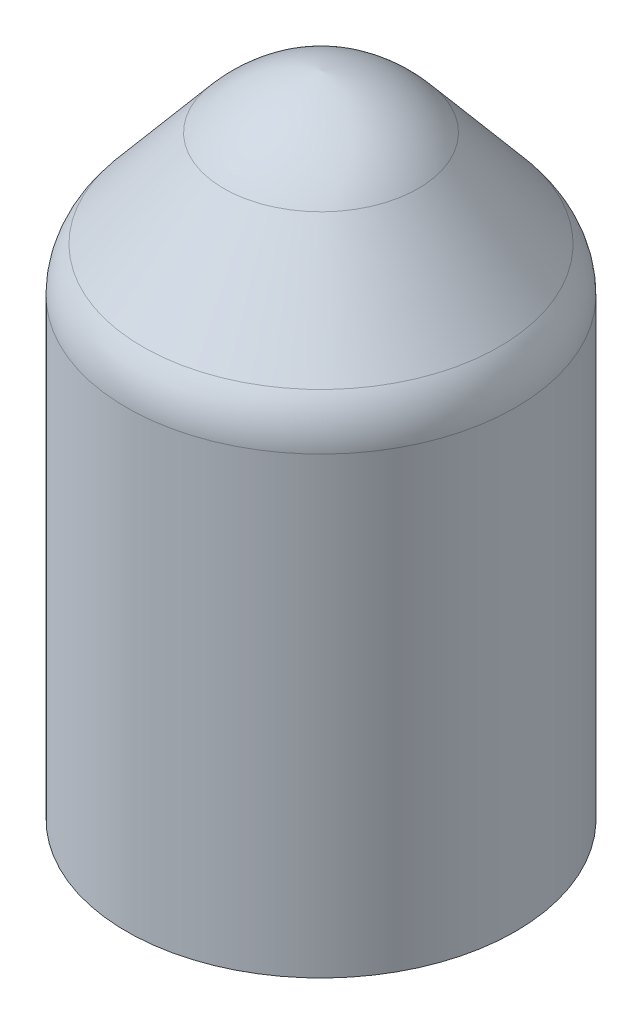
ISO-10303-21;
HEADER;
FILE_DESCRIPTION(('STEP AP214'),'2;1');
FILE_NAME('part.step','',(''),(''),'','','');
FILE_SCHEMA(('AUTOMOTIVE_DESIGN { 1 0 10303 214 1 1 1 1 }'));
ENDSEC;
DATA;
#1=APPLICATION_CONTEXT('core data for automotive mechanical design processes');
#2=APPLICATION_PROTOCOL_DEFINITION('international standard','automotive_design',2000,#1);
#3=PRODUCT_CONTEXT('',#1,'mechanical');
#4=PRODUCT('Part','Part','',(#3));
#5=PRODUCT_RELATED_PRODUCT_CATEGORY('part','',(#4));
#6=PRODUCT_DEFINITION_FORMATION('','',#4);
#7=PRODUCT_DEFINITION_CONTEXT('part definition',#1,'design');
#8=PRODUCT_DEFINITION('design','',#6,#7);
#9=PRODUCT_DEFINITION_SHAPE('','',#8);
#10=(LENGTH_UNIT() NAMED_UNIT(*) SI_UNIT(.MILLI.,.METRE.));
#11=(NAMED_UNIT(*) PLANE_ANGLE_UNIT() SI_UNIT($,.RADIAN.));
#12=(NAMED_UNIT(*) SI_UNIT($,.STERADIAN.) SOLID_ANGLE_UNIT());
#13=UNCERTAINTY_MEASURE_WITH_UNIT(LENGTH_MEASURE(1.E-05),#10,'distance_accuracy_value','');
#14=(GEOMETRIC_REPRESENTATION_CONTEXT(3) GLOBAL_UNCERTAINTY_ASSIGNED_CONTEXT((#13)) GLOBAL_UNIT_ASSIGNED_CONTEXT((#10,
#11,#12)) REPRESENTATION_CONTEXT('',''));
#15=CARTESIAN_POINT('',(0.,0.,0.));
#16=DIRECTION('',(0.,0.,1.));
#17=DIRECTION('',(1.,0.,0.));
#18=AXIS2_PLACEMENT_3D('',#15,#16,#17);
#19=CARTESIAN_POINT('',(60.,0.,0.));
#20=DIRECTION('',(0.,1.,0.));
#21=DIRECTION('',(-1.,0.,0.));
#22=AXIS2_PLACEMENT_3D('',#19,#20,#21);
#23=PLANE('',#22);
#24=CARTESIAN_POINT('',(0.,0.,0.));
#25=DIRECTION('',(0.,1.,0.));
#26=DIRECTION('',(-1.,0.,0.));
#27=AXIS2_PLACEMENT_3D('',#24,#25,#26);
#28=CIRCLE('',#27,58.);
#29=CARTESIAN_POINT('',(-58.,0.,0.));
#30=VERTEX_POINT('',#29);
#31=EDGE_CURVE('E62',#30,#30,#28,.T.);
#32=ORIENTED_EDGE('',*,*,#31,.T.);
#33=EDGE_LOOP('',(#32));
#34=FACE_BOUND('',#33,.T.);
#35=CARTESIAN_POINT('',(0.,0.,0.));
#36=DIRECTION('',(0.,1.,0.));
#37=DIRECTION('',(-1.,0.,0.));
#38=AXIS2_PLACEMENT_3D('',#35,#36,#37);
#39=CIRCLE('',#38,60.);
#40=CARTESIAN_POINT('',(-60.,0.,0.));
#41=VERTEX_POINT('',#40);
#42=EDGE_CURVE('E11',#41,#41,#39,.T.);
#43=ORIENTED_EDGE('',*,*,#42,.F.);
#44=EDGE_LOOP('',(#43));
#45=FACE_BOUND('',#44,.T.);
#46=ADVANCED_FACE('F33',(#34,#45),#23,.F.);
#47=CARTESIAN_POINT('',(0.,200.,0.));
#48=DIRECTION('',(0.,1.,0.));
#49=DIRECTION('',(-1.,0.,0.));
#50=AXIS2_PLACEMENT_3D('',#47,#48,#49);
#51=CYLINDRICAL_SURFACE('',#50,60.);
#52=CARTESIAN_POINT('',(0.,140.,0.));
#53=DIRECTION('',(0.,1.,0.));
#54=DIRECTION('',(-1.,0.,0.));
#55=AXIS2_PLACEMENT_3D('',#52,#53,#54);
#56=CIRCLE('',#55,60.);
#57=CARTESIAN_POINT('',(-60.,140.,0.));
#58=VERTEX_POINT('',#57);
#59=EDGE_CURVE('E40',#58,#58,#56,.T.);
#60=ORIENTED_EDGE('',*,*,#59,.F.);
#61=EDGE_LOOP('',(#60));
#62=FACE_BOUND('',#61,.T.);
#63=ORIENTED_EDGE('',*,*,#42,.T.);
#64=EDGE_LOOP('',(#63));
#65=FACE_BOUND('',#64,.T.);
#66=ADVANCED_FACE('F75',(#62,#65),#51,.T.);
#67=CARTESIAN_POINT('',(0.,140.,0.));
#68=DIRECTION('',(0.,1.,0.));
#69=DIRECTION('',(-1.,0.,0.));
#70=AXIS2_PLACEMENT_3D('',#67,#68,#69);
#71=TOROIDAL_SURFACE('',#70,38.6284195739671,21.3715804260329);
#72=CARTESIAN_POINT('',(0.,153.737387097273,0.));
#73=DIRECTION('',(0.,1.,0.));
#74=DIRECTION('',(-1.,0.,0.));
#75=AXIS2_PLACEMENT_3D('',#72,#73,#74);
#76=CIRCLE('',#75,55.);
#77=CARTESIAN_POINT('',(-55.,153.737387097273,0.));
#78=VERTEX_POINT('',#77);
#79=EDGE_CURVE('E68',#78,#78,#76,.T.);
#80=ORIENTED_EDGE('',*,*,#79,.F.);
#81=EDGE_LOOP('',(#80));
#82=FACE_BOUND('',#81,.T.);
#83=ORIENTED_EDGE('',*,*,#59,.T.);
#84=EDGE_LOOP('',(#83));
#85=FACE_BOUND('',#84,.T.);
#86=ADVANCED_FACE('F73',(#82,#85),#71,.T.);
#87=CARTESIAN_POINT('',(0.,153.737387097273,0.));
#88=DIRECTION('',(0.,-1.,0.));
#89=DIRECTION('',(1.,0.,0.));
#90=AXIS2_PLACEMENT_3D('',#87,#88,#89);
#91=CONICAL_SURFACE('',#90,55.,0.698131700797726);
#92=CARTESIAN_POINT('',(0.,183.531226912129,0.));
#93=DIRECTION('',(0.,1.,0.));
#94=DIRECTION('',(-1.,0.,0.));
#95=AXIS2_PLACEMENT_3D('',#92,#93,#94);
#96=CIRCLE('',#95,30.);
#97=CARTESIAN_POINT('',(-30.,183.531226912129,0.));
#98=VERTEX_POINT('',#97);
#99=EDGE_CURVE('E65',#98,#98,#96,.T.);
#100=ORIENTED_EDGE('',*,*,#99,.F.);
#101=EDGE_LOOP('',(#100));
#102=FACE_BOUND('',#101,.T.);
#103=ORIENTED_EDGE('',*,*,#79,.T.);
#104=EDGE_LOOP('',(#103));
#105=FACE_BOUND('',#104,.T.);
#106=ADVANCED_FACE('F98',(#102,#105),#91,.T.);
#107=CARTESIAN_POINT('',(6.19109595076613,153.16329164794,0.));
#108=DIRECTION('',(0.,0.,-1.));
#109=DIRECTION('',(-1.,0.,0.));
#110=AXIS2_PLACEMENT_3D('',#107,#108,#109);
#111=CIRCLE('',#110,47.2441204630538);
#112=TRIMMED_CURVE('',#111,(PARAMETER_VALUE(-1.43937353985795)),
(PARAMETER_VALUE(1.43937353985795)),.T.,.PARAMETER.);
#113=CARTESIAN_POINT('',(0.,153.16329164794,0.));
#114=DIRECTION('',(0.,1.,0.));
#115=AXIS1_PLACEMENT('',#113,#114);
#116=SURFACE_OF_REVOLUTION('',#112,#115);
#117=CARTESIAN_POINT('',(0.,200.,0.));
#118=VERTEX_POINT('',#117);
#119=VERTEX_LOOP('',#118);
#120=FACE_BOUND('',#119,.T.);
#121=ORIENTED_EDGE('',*,*,#99,.T.);
#122=EDGE_LOOP('',(#121));
#123=FACE_BOUND('',#122,.T.);
#124=ADVANCED_FACE('F89',(#120,#123),#116,.T.);
#125=CARTESIAN_POINT('',(0.,200.,0.));
#126=DIRECTION('',(0.,1.,0.));
#127=DIRECTION('',(-1.,0.,0.));
#128=AXIS2_PLACEMENT_3D('',#125,#126,#127);
#129=CYLINDRICAL_SURFACE('',#128,58.);
#130=CARTESIAN_POINT('',(0.,140.,0.));
#131=DIRECTION('',(0.,1.,0.));
#132=DIRECTION('',(-1.,0.,0.));
#133=AXIS2_PLACEMENT_3D('',#130,#131,#132);
#134=CIRCLE('',#133,58.);
#135=CARTESIAN_POINT('',(-58.,140.,0.));
#136=VERTEX_POINT('',#135);
#137=EDGE_CURVE('E58',#136,#136,#134,.T.);
#138=ORIENTED_EDGE('',*,*,#137,.T.);
#139=EDGE_LOOP('',(#138));
#140=FACE_BOUND('',#139,.T.);
#141=ORIENTED_EDGE('',*,*,#31,.F.);
#142=EDGE_LOOP('',(#141));
#143=FACE_BOUND('',#142,.T.);
#144=ADVANCED_FACE('F86',(#140,#143),#129,.F.);
#145=CARTESIAN_POINT('',(0.,140.,0.));
#146=DIRECTION('',(0.,1.,0.));
#147=DIRECTION('',(-1.,0.,0.));
#148=AXIS2_PLACEMENT_3D('',#145,#146,#147);
#149=TOROIDAL_SURFACE('',#148,38.6284195739671,19.3715804260329);
#150=CARTESIAN_POINT('',(0.,152.4518118779,0.));
#151=DIRECTION('',(0.,-1.,0.));
#152=DIRECTION('',(1.,0.,0.));
#153=AXIS2_PLACEMENT_3D('',#150,#151,#152);
#154=CIRCLE('',#153,53.467911113762);
#155=CARTESIAN_POINT('',(53.467911113762,152.4518118779,0.));
#156=VERTEX_POINT('',#155);
#157=EDGE_CURVE('E55',#156,#156,#154,.F.);
#158=ORIENTED_EDGE('',*,*,#157,.T.);
#159=EDGE_LOOP('',(#158));
#160=FACE_BOUND('',#159,.T.);
#161=ORIENTED_EDGE('',*,*,#137,.F.);
#162=EDGE_LOOP('',(#161));
#163=FACE_BOUND('',#162,.T.);
#164=ADVANCED_FACE('F88',(#160,#163),#149,.F.);
#165=CARTESIAN_POINT('',(0.,152.4518118779,0.));
#166=DIRECTION('',(0.,-1.,0.));
#167=DIRECTION('',(1.,0.,0.));
#168=AXIS2_PLACEMENT_3D('',#165,#166,#167);
#169=CONICAL_SURFACE('',#168,53.4679111137621,0.698131700797726);
#170=CARTESIAN_POINT('',(0.,182.245651692756,0.));
#171=DIRECTION('',(0.,1.,0.));
#172=DIRECTION('',(-1.,0.,0.));
#173=AXIS2_PLACEMENT_3D('',#170,#171,#172);
#174=CIRCLE('',#173,28.467911113762);
#175=CARTESIAN_POINT('',(-28.467911113762,182.245651692756,0.));
#176=VERTEX_POINT('',#175);
#177=EDGE_CURVE('E53',#176,#176,#174,.T.);
#178=ORIENTED_EDGE('',*,*,#177,.T.);
#179=EDGE_LOOP('',(#178));
#180=FACE_BOUND('',#179,.T.);
#181=ORIENTED_EDGE('',*,*,#157,.F.);
#182=EDGE_LOOP('',(#181));
#183=FACE_BOUND('',#182,.T.);
#184=ADVANCED_FACE('F49',(#180,#183),#169,.F.);
#185=CARTESIAN_POINT('',(6.19109595076613,153.16329164794,0.));
#186=DIRECTION('',(0.,0.,-1.));
#187=DIRECTION('',(-1.,0.,0.));
#188=AXIS2_PLACEMENT_3D('',#185,#186,#187);
#189=CIRCLE('',#188,45.2441204630538);
#190=TRIMMED_CURVE('',#189,(PARAMETER_VALUE(-1.433528071598)),(PARAMETER_VALUE(1.433528071598)),
.T.,.PARAMETER.);
#191=CARTESIAN_POINT('',(0.,153.16329164794,0.));
#192=DIRECTION('',(0.,1.,0.));
#193=AXIS1_PLACEMENT('',#191,#192);
#194=SURFACE_OF_REVOLUTION('',#190,#193);
#195=CARTESIAN_POINT('',(0.,197.981823165647,0.));
#196=VERTEX_POINT('',#195);
#197=VERTEX_LOOP('',#196);
#198=FACE_BOUND('',#197,.T.);
#199=ORIENTED_EDGE('',*,*,#177,.F.);
#200=EDGE_LOOP('',(#199));
#201=FACE_BOUND('',#200,.T.);
#202=ADVANCED_FACE('F46',(#198,#201),#194,.F.);
#203=CLOSED_SHELL('',(#46,#66,#86,#106,#124,#144,#164,#184,#202));
#204=MANIFOLD_SOLID_BREP('B2',#203);
#205=ADVANCED_BREP_SHAPE_REPRESENTATION('',(#18,#204),#14);
#206=SHAPE_DEFINITION_REPRESENTATION(#9,#205);
ENDSEC;
END-ISO-10303-21;
